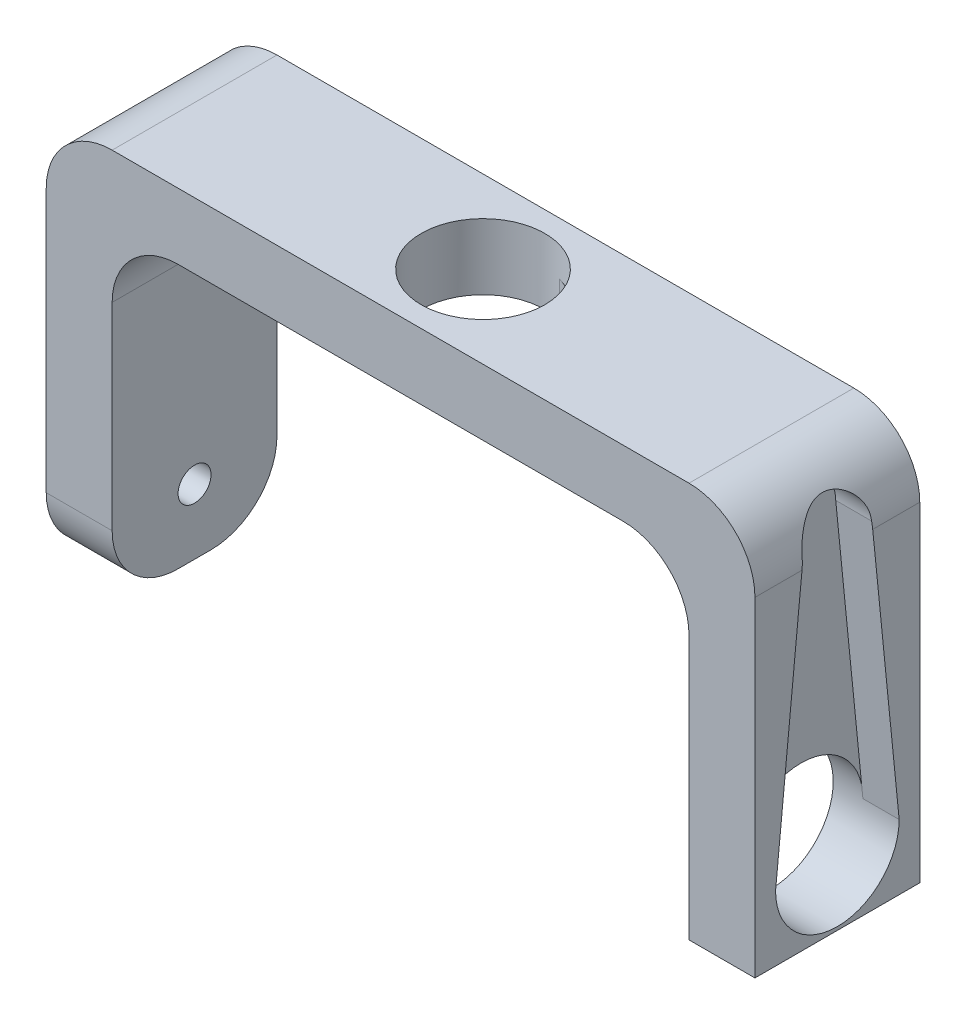
ISO-10303-21;
HEADER;
FILE_DESCRIPTION(('STEP AP214'),'2;1');
FILE_NAME('part.step','',(''),(''),'','','');
FILE_SCHEMA(('AUTOMOTIVE_DESIGN { 1 0 10303 214 1 1 1 1 }'));
ENDSEC;
DATA;
#1=APPLICATION_CONTEXT('core data for automotive mechanical design processes');
#2=APPLICATION_PROTOCOL_DEFINITION('international standard','automotive_design',2000,#1);
#3=PRODUCT_CONTEXT('',#1,'mechanical');
#4=PRODUCT('Part','Part','',(#3));
#5=PRODUCT_RELATED_PRODUCT_CATEGORY('part','',(#4));
#6=PRODUCT_DEFINITION_FORMATION('','',#4);
#7=PRODUCT_DEFINITION_CONTEXT('part definition',#1,'design');
#8=PRODUCT_DEFINITION('design','',#6,#7);
#9=PRODUCT_DEFINITION_SHAPE('','',#8);
#10=(LENGTH_UNIT() NAMED_UNIT(*) SI_UNIT(.MILLI.,.METRE.));
#11=(NAMED_UNIT(*) PLANE_ANGLE_UNIT() SI_UNIT($,.RADIAN.));
#12=(NAMED_UNIT(*) SI_UNIT($,.STERADIAN.) SOLID_ANGLE_UNIT());
#13=UNCERTAINTY_MEASURE_WITH_UNIT(LENGTH_MEASURE(1.E-05),#10,'distance_accuracy_value','');
#14=(GEOMETRIC_REPRESENTATION_CONTEXT(3) GLOBAL_UNCERTAINTY_ASSIGNED_CONTEXT((#13)) GLOBAL_UNIT_ASSIGNED_CONTEXT((#10,
#11,#12)) REPRESENTATION_CONTEXT('',''));
#15=CARTESIAN_POINT('',(0.,0.,0.));
#16=DIRECTION('',(0.,0.,1.));
#17=DIRECTION('',(1.,0.,0.));
#18=AXIS2_PLACEMENT_3D('',#15,#16,#17);
#19=CARTESIAN_POINT('',(13.5,-3.99999999999999,10.));
#20=DIRECTION('',(0.,0.,1.));
#21=DIRECTION('',(1.,0.,0.));
#22=AXIS2_PLACEMENT_3D('',#19,#20,#21);
#23=CYLINDRICAL_SURFACE('',#22,4.);
#24=CARTESIAN_POINT('',(16.,-0.877501000800792,3.5));
#25=CARTESIAN_POINT('',(16.0499443258754,-0.917480572917894,3.50000664736922));
#26=CARTESIAN_POINT('',(16.0988720306926,-0.958628836505276,3.50249284320046));
#27=CARTESIAN_POINT('',(16.194399561014,-1.04293170834118,3.51187627364179));
#28=CARTESIAN_POINT('',(16.2410028763124,-1.08608310874983,3.51876666693516));
#29=CARTESIAN_POINT('',(16.3762972155051,-1.21744625962051,3.54507868083405));
#30=CARTESIAN_POINT('',(16.4613770101921,-1.30829481005846,3.57016138159402));
#31=CARTESIAN_POINT('',(16.6010704584706,-1.47177795685902,3.62419177130241));
#32=CARTESIAN_POINT('',(16.6580019628395,-1.54333063265978,3.65063131878916));
#33=CARTESIAN_POINT('',(16.7659257744413,-1.68873979330161,3.70883278935634));
#34=CARTESIAN_POINT('',(16.8169157966829,-1.76259715073019,3.74059674873665));
#35=CARTESIAN_POINT('',(16.9615914526269,-1.98770816889874,3.84269715337706));
#36=CARTESIAN_POINT('',(17.0463809668835,-2.14178572278003,3.91958779651535));
#37=CARTESIAN_POINT('',(17.1719451393046,-2.40882707410655,4.06049477439984));
#38=CARTESIAN_POINT('',(17.2183494901931,-2.52072060403145,4.12175493815134));
#39=CARTESIAN_POINT('',(17.3003058995101,-2.74618204567143,4.24840610434412));
#40=CARTESIAN_POINT('',(17.3358529282826,-2.85975070793188,4.31379900439806));
#41=CARTESIAN_POINT('',(17.4265814481101,-3.20158127905848,4.51389690071893));
#42=CARTESIAN_POINT('',(17.4661725746963,-3.43167039461583,4.65290508939552));
#43=CARTESIAN_POINT('',(17.4949405919345,-3.771100158997,4.85984111285279));
#44=CARTESIAN_POINT('',(17.4996914634749,-3.8801548314944,4.92661053893652));
#45=CARTESIAN_POINT('',(17.4999951476347,-3.99280852919261,4.99559613810625));
#46=CARTESIAN_POINT('',(17.4999999957969,-3.99640426422287,4.99779806702525));
#47=CARTESIAN_POINT('',(17.5,-3.99999999999999,5.));
#48=B_SPLINE_CURVE_WITH_KNOTS('',3,(#24,#25,#26,#27,#28,#29,#30,#31,#32,#33,#34,#35,#36,#37,#38,
#39,#40,#41,#42,#43,#44,#45,#46,#47),.UNSPECIFIED.,.F.,.F.,(4,2,2,2,2,2,2,2,2,2,2,4),(0.,
0.191756168751828,0.383215192100421,0.762689546213962,1.04789290536096,1.33320558929084,
1.90670189767263,2.31346528001308,2.7204168107548,3.53176072505478,3.91540650413547,
3.92805562313924),.UNSPECIFIED.);
#49=CARTESIAN_POINT('',(17.5,-3.99999999999999,5.));
#50=VERTEX_POINT('',#49);
#51=CARTESIAN_POINT('',(16.,-0.877501000800793,3.5));
#52=VERTEX_POINT('',#51);
#53=EDGE_CURVE('E238',#50,#52,#48,.F.);
#54=ORIENTED_EDGE('',*,*,#53,.T.);
#55=CARTESIAN_POINT('',(13.5,-3.99999999999999,3.1484375));
#56=DIRECTION('',(0.139254831399099,0.,-0.990256578838035));
#57=DIRECTION('',(0.990256578838035,0.,0.139254831399099));
#58=AXIS2_PLACEMENT_3D('',#55,#56,#57);
#59=ELLIPSE('',#58,4.03935715801413,4.);
#60=CARTESIAN_POINT('',(13.5,0.,3.1484375));
#61=VERTEX_POINT('',#60);
#62=EDGE_CURVE('E46',#52,#61,#59,.F.);
#63=ORIENTED_EDGE('',*,*,#62,.T.);
#64=DIRECTION('',(0.,0.,-1.));
#65=VECTOR('',#64,1.);
#66=CARTESIAN_POINT('',(13.5,0.,10.));
#67=LINE('',#66,#65);
#68=CARTESIAN_POINT('',(13.5,0.,0.));
#69=VERTEX_POINT('',#68);
#70=EDGE_CURVE('E427',#69,#61,#67,.F.);
#71=ORIENTED_EDGE('',*,*,#70,.F.);
#72=CARTESIAN_POINT('',(13.5,-3.99999999999999,0.));
#73=DIRECTION('',(0.,0.,-1.));
#74=DIRECTION('',(-1.,0.,0.));
#75=AXIS2_PLACEMENT_3D('',#72,#73,#74);
#76=CIRCLE('',#75,4.);
#77=CARTESIAN_POINT('',(17.5,-3.99999999999999,0.));
#78=VERTEX_POINT('',#77);
#79=EDGE_CURVE('E431',#78,#69,#76,.F.);
#80=ORIENTED_EDGE('',*,*,#79,.F.);
#81=DIRECTION('',(0.,0.,-1.));
#82=VECTOR('',#81,1.);
#83=CARTESIAN_POINT('',(17.5,-3.99999999999999,0.));
#84=LINE('',#83,#82);
#85=EDGE_CURVE('E299',#50,#78,#84,.T.);
#86=ORIENTED_EDGE('',*,*,#85,.F.);
#87=EDGE_LOOP('',(#54,#63,#71,#80,#86));
#88=FACE_BOUND('',#87,.T.);
#89=ADVANCED_FACE('F37',(#88),#23,.F.);
#90=CARTESIAN_POINT('',(21.5,0.,10.));
#91=DIRECTION('',(-1.,0.,0.));
#92=DIRECTION('',(0.,-1.,0.));
#93=AXIS2_PLACEMENT_3D('',#90,#91,#92);
#94=PLANE('',#93);
#95=DIRECTION('',(0.,0.995037190209989,0.0995037190209989));
#96=VECTOR('',#95,1.);
#97=CARTESIAN_POINT('',(21.5,-0.282673267326725,2.82673267326733));
#98=LINE('',#97,#96);
#99=CARTESIAN_POINT('',(21.5,-16.05,1.25));
#100=VERTEX_POINT('',#99);
#101=CARTESIAN_POINT('',(21.5,0.,2.855));
#102=VERTEX_POINT('',#101);
#103=EDGE_CURVE('E323',#100,#102,#98,.T.);
#104=ORIENTED_EDGE('',*,*,#103,.F.);
#105=CARTESIAN_POINT('',(21.5,-16.05,5.));
#106=DIRECTION('',(-1.,0.,0.));
#107=DIRECTION('',(0.,-1.,0.));
#108=AXIS2_PLACEMENT_3D('',#105,#106,#107);
#109=CIRCLE('',#108,3.75);
#110=CARTESIAN_POINT('',(21.5,-16.05,8.75));
#111=VERTEX_POINT('',#110);
#112=EDGE_CURVE('E325',#100,#111,#109,.T.);
#113=ORIENTED_EDGE('',*,*,#112,.T.);
#114=DIRECTION('',(0.,-0.995037190209989,0.099503719020999));
#115=VECTOR('',#114,1.);
#116=CARTESIAN_POINT('',(21.5,0.707425742574265,7.07425742574258));
#117=LINE('',#116,#115);
#118=CARTESIAN_POINT('',(21.5,0.,7.145));
#119=VERTEX_POINT('',#118);
#120=EDGE_CURVE('E329',#119,#111,#117,.T.);
#121=ORIENTED_EDGE('',*,*,#120,.F.);
#122=DIRECTION('',(0.,0.,-1.));
#123=VECTOR('',#122,1.);
#124=CARTESIAN_POINT('',(21.5,0.,10.));
#125=LINE('',#124,#123);
#126=CARTESIAN_POINT('',(21.5,0.,10.));
#127=VERTEX_POINT('',#126);
#128=EDGE_CURVE('E411',#119,#127,#125,.F.);
#129=ORIENTED_EDGE('',*,*,#128,.T.);
#130=DIRECTION('',(0.,1.,0.));
#131=VECTOR('',#130,1.);
#132=CARTESIAN_POINT('',(21.5,0.,10.));
#133=LINE('',#132,#131);
#134=CARTESIAN_POINT('',(21.5,-20.,10.));
#135=VERTEX_POINT('',#134);
#136=EDGE_CURVE('E367',#135,#127,#133,.T.);
#137=ORIENTED_EDGE('',*,*,#136,.F.);
#138=DIRECTION('',(0.,0.,-1.));
#139=VECTOR('',#138,1.);
#140=CARTESIAN_POINT('',(21.5,-20.,10.));
#141=LINE('',#140,#139);
#142=CARTESIAN_POINT('',(21.5,-20.,0.));
#143=VERTEX_POINT('',#142);
#144=EDGE_CURVE('E373',#135,#143,#141,.T.);
#145=ORIENTED_EDGE('',*,*,#144,.T.);
#146=DIRECTION('',(0.,1.,0.));
#147=VECTOR('',#146,1.);
#148=CARTESIAN_POINT('',(21.5,0.,0.));
#149=LINE('',#148,#147);
#150=CARTESIAN_POINT('',(21.5,0.,0.));
#151=VERTEX_POINT('',#150);
#152=EDGE_CURVE('E388',#143,#151,#149,.T.);
#153=ORIENTED_EDGE('',*,*,#152,.T.);
#154=EDGE_CURVE('E412',#151,#102,#125,.F.);
#155=ORIENTED_EDGE('',*,*,#154,.T.);
#156=EDGE_LOOP('',(#104,#113,#121,#129,#137,#145,#153,#155));
#157=FACE_BOUND('',#156,.T.);
#158=ADVANCED_FACE('F286',(#157),#94,.F.);
#159=CARTESIAN_POINT('',(17.5,0.,10.));
#160=DIRECTION('',(0.,0.,-1.));
#161=DIRECTION('',(-1.,0.,0.));
#162=AXIS2_PLACEMENT_3D('',#159,#160,#161);
#163=CYLINDRICAL_SURFACE('',#162,4.);
#164=CARTESIAN_POINT('',(21.4746068988014,0.450000000000017,2.9));
#165=CARTESIAN_POINT('',(21.4681675351765,0.506973592942359,2.89999087678292));
#166=CARTESIAN_POINT('',(21.4604830273316,0.563793256044316,2.90231813602664));
#167=CARTESIAN_POINT('',(21.4427619169186,0.676658026146143,2.91150306465754));
#168=CARTESIAN_POINT('',(21.4327268687985,0.732703619222742,2.91835774542053));
#169=CARTESIAN_POINT('',(21.4104964865748,0.843319045639043,2.93640481496226));
#170=CARTESIAN_POINT('',(21.3983135725214,0.89789538853453,2.94757268256058));
#171=CARTESIAN_POINT('',(21.3719485484852,1.00552956987553,2.97405284298865));
#172=CARTESIAN_POINT('',(21.3577661683049,1.05858720192263,2.98936569620797));
#173=CARTESIAN_POINT('',(21.3126210816327,1.21474384832189,3.04113480206087));
#174=CARTESIAN_POINT('',(21.2789862292442,1.31518642312177,3.0834821818744));
#175=CARTESIAN_POINT('',(21.2066873874522,1.50699192435991,3.18218648570632));
#176=CARTESIAN_POINT('',(21.168016684352,1.59834243736541,3.23856220508652));
#177=CARTESIAN_POINT('',(21.0842453497548,1.77875262584939,3.36966859631342));
#178=CARTESIAN_POINT('',(21.0388814269496,1.86680344889192,3.44562100882886));
#179=CARTESIAN_POINT('',(20.9482366624768,2.02937170828097,3.61109265196378));
#180=CARTESIAN_POINT('',(20.9029560236809,2.10387018014269,3.7006305771895));
#181=CARTESIAN_POINT('',(20.8124963994499,2.2438587348356,3.90077034041544));
#182=CARTESIAN_POINT('',(20.767691858097,2.30793864148862,4.01254178363922));
#183=CARTESIAN_POINT('',(20.6890863185897,2.41540924834848,4.24906482180221));
#184=CARTESIAN_POINT('',(20.6552518462896,2.45886307906207,4.37377536703262));
#185=CARTESIAN_POINT('',(20.6129149222645,2.51207674201889,4.59223127142897));
#186=CARTESIAN_POINT('',(20.5998087890453,2.52810928883553,4.68356709562185));
#187=CARTESIAN_POINT('',(20.583545156348,2.54792597100415,4.86840438116769));
#188=CARTESIAN_POINT('',(20.5803776115965,2.55172247385249,4.96190355956293));
#189=CARTESIAN_POINT('',(20.5844229477366,2.54682967952268,5.14836802143399));
#190=CARTESIAN_POINT('',(20.591639936625,2.53813544115933,5.24133307900961));
#191=CARTESIAN_POINT('',(20.6154807994742,2.50880939181318,5.42413561031941));
#192=CARTESIAN_POINT('',(20.6321126283867,2.48816748546519,5.51397037091949));
#193=CARTESIAN_POINT('',(20.6732760524602,2.43545654313032,5.69037743076212));
#194=CARTESIAN_POINT('',(20.6979642410422,2.40315952475895,5.77684351505162));
#195=CARTESIAN_POINT('',(20.7527961302297,2.32840370934786,5.94336670218473));
#196=CARTESIAN_POINT('',(20.7829417146468,2.28594140176514,6.02342157816845));
#197=CARTESIAN_POINT('',(20.853068952875,2.18211139575872,6.19228208686113));
#198=CARTESIAN_POINT('',(20.8937974150689,2.11865102805151,6.27949163057972));
#199=CARTESIAN_POINT('',(20.9767686895053,1.97955851140038,6.44290726896988));
#200=CARTESIAN_POINT('',(21.0190133476965,1.90391110524927,6.51909934074123));
#201=CARTESIAN_POINT('',(21.1090807180592,1.72796209189734,6.67107098245369));
#202=CARTESIAN_POINT('',(21.1566664392876,1.62565236609649,6.74468601676938));
#203=CARTESIAN_POINT('',(21.2459659740646,1.40766819364366,6.87317849727017));
#204=CARTESIAN_POINT('',(21.2876909347815,1.29201990177049,6.9280918056657));
#205=CARTESIAN_POINT('',(21.3419786779214,1.1147672157086,6.99291286685265));
#206=CARTESIAN_POINT('',(21.3582248263646,1.05724107754214,7.01120259220349));
#207=CARTESIAN_POINT('',(21.3883890763154,0.940250611238677,7.04287091423451));
#208=CARTESIAN_POINT('',(21.4023077276067,0.880786744793846,7.0562506716048));
#209=CARTESIAN_POINT('',(21.427628596704,0.759974429472243,7.07790861538969));
#210=CARTESIAN_POINT('',(21.4390131326097,0.698615944296202,7.0861516358715));
#211=CARTESIAN_POINT('',(21.4589708974405,0.574902146761671,7.09720637746815));
#212=CARTESIAN_POINT('',(21.4675414458305,0.512545942942872,7.10001293233423));
#213=CARTESIAN_POINT('',(21.4746068988014,0.450000000000018,7.1));
#214=B_SPLINE_CURVE_WITH_KNOTS('',3,(#164,#165,#166,#167,#168,#169,#170,#171,#172,#173,#174,
#175,#176,#177,#178,#179,#180,#181,#182,#183,#184,#185,#186,#187,#188,#189,#190,#191,#192,#193,
#194,#195,#196,#197,#198,#199,#200,#201,#202,#203,#204,#205,#206,#207,#208,#209,#210,#211,#212,
#213),.UNSPECIFIED.,.F.,.F.,(4,2,2,2,2,2,2,2,2,2,2,2,2,2,2,2,2,2,2,2,2,2,2,2,4),(0.,
0.171928187875553,0.343742996449487,0.514595056234783,0.685470226250354,1.02611736950578,
1.36722339734321,1.74015322622361,2.11360096619102,2.52059205552011,2.92632929867399,
3.20607770479334,3.48554326833774,3.76511941550301,4.04493214039743,4.33054454913269,
4.61625573565058,4.96084153522744,5.30586213004962,5.70810930821384,6.10958074061249,
6.29689843683584,6.48417182359157,6.67271358520368,6.86143442947186),.UNSPECIFIED.);
#215=CARTESIAN_POINT('',(21.4746068988014,0.450000000000017,2.9));
#216=VERTEX_POINT('',#215);
#217=CARTESIAN_POINT('',(21.4746068988014,0.450000000000017,7.1));
#218=VERTEX_POINT('',#217);
#219=EDGE_CURVE('E442',#216,#218,#214,.T.);
#220=ORIENTED_EDGE('',*,*,#219,.F.);
#221=CARTESIAN_POINT('',(17.5,0.,2.855));
#222=DIRECTION('',(0.,-0.0995037190209989,0.995037190209989));
#223=DIRECTION('',(0.,-0.995037190209989,-0.0995037190209989));
#224=AXIS2_PLACEMENT_3D('',#221,#222,#223);
#225=ELLIPSE('',#224,4.01995024844836,4.);
#226=EDGE_CURVE('E450',#216,#102,#225,.F.);
#227=ORIENTED_EDGE('',*,*,#226,.T.);
#228=ORIENTED_EDGE('',*,*,#154,.F.);
#229=CARTESIAN_POINT('',(17.5,0.,0.));
#230=DIRECTION('',(0.,0.,-1.));
#231=DIRECTION('',(-1.,0.,0.));
#232=AXIS2_PLACEMENT_3D('',#229,#230,#231);
#233=CIRCLE('',#232,4.);
#234=CARTESIAN_POINT('',(17.5,4.00000000000001,0.));
#235=VERTEX_POINT('',#234);
#236=EDGE_CURVE('E409',#235,#151,#233,.T.);
#237=ORIENTED_EDGE('',*,*,#236,.F.);
#238=DIRECTION('',(0.,0.,-1.));
#239=VECTOR('',#238,1.);
#240=CARTESIAN_POINT('',(17.5,4.00000000000001,10.));
#241=LINE('',#240,#239);
#242=CARTESIAN_POINT('',(17.5,4.00000000000001,10.));
#243=VERTEX_POINT('',#242);
#244=EDGE_CURVE('E404',#243,#235,#241,.T.);
#245=ORIENTED_EDGE('',*,*,#244,.F.);
#246=CARTESIAN_POINT('',(17.5,0.,10.));
#247=DIRECTION('',(0.,0.,-1.));
#248=DIRECTION('',(-1.,0.,0.));
#249=AXIS2_PLACEMENT_3D('',#246,#247,#248);
#250=CIRCLE('',#249,4.);
#251=EDGE_CURVE('E417',#127,#243,#250,.F.);
#252=ORIENTED_EDGE('',*,*,#251,.F.);
#253=ORIENTED_EDGE('',*,*,#128,.F.);
#254=CARTESIAN_POINT('',(17.5,0.,7.145));
#255=DIRECTION('',(0.,-0.0995037190209989,-0.995037190209989));
#256=DIRECTION('',(0.,0.995037190209989,-0.099503719020999));
#257=AXIS2_PLACEMENT_3D('',#254,#255,#256);
#258=ELLIPSE('',#257,4.01995024844836,4.);
#259=EDGE_CURVE('E439',#119,#218,#258,.F.);
#260=ORIENTED_EDGE('',*,*,#259,.T.);
#261=EDGE_LOOP('',(#220,#227,#228,#237,#245,#252,#253,#260));
#262=FACE_BOUND('',#261,.T.);
#263=ADVANCED_FACE('F291',(#262),#163,.T.);
#264=CARTESIAN_POINT('',(-21.5,0.,10.));
#265=DIRECTION('',(1.,0.,0.));
#266=DIRECTION('',(0.,1.,0.));
#267=AXIS2_PLACEMENT_3D('',#264,#265,#266);
#268=PLANE('',#267);
#269=CARTESIAN_POINT('',(-21.5,-16.05,5.));
#270=DIRECTION('',(-1.,0.,0.));
#271=DIRECTION('',(0.,-1.,0.));
#272=AXIS2_PLACEMENT_3D('',#269,#270,#271);
#273=CIRCLE('',#272,1.);
#274=CARTESIAN_POINT('',(-21.5,-17.05,5.));
#275=VERTEX_POINT('',#274);
#276=EDGE_CURVE('E311',#275,#275,#273,.T.);
#277=ORIENTED_EDGE('',*,*,#276,.F.);
#278=EDGE_LOOP('',(#277));
#279=FACE_BOUND('',#278,.T.);
#280=DIRECTION('',(0.,-1.,0.));
#281=VECTOR('',#280,1.);
#282=CARTESIAN_POINT('',(-21.5,0.,0.));
#283=LINE('',#282,#281);
#284=CARTESIAN_POINT('',(-21.5,0.,0.));
#285=VERTEX_POINT('',#284);
#286=CARTESIAN_POINT('',(-21.5,-16.,0.));
#287=VERTEX_POINT('',#286);
#288=EDGE_CURVE('E345',#285,#287,#283,.T.);
#289=ORIENTED_EDGE('',*,*,#288,.T.);
#290=CARTESIAN_POINT('',(-21.5,-16.,4.));
#291=DIRECTION('',(1.,0.,0.));
#292=DIRECTION('',(0.,1.,0.));
#293=AXIS2_PLACEMENT_3D('',#290,#291,#292);
#294=CIRCLE('',#293,4.);
#295=CARTESIAN_POINT('',(-21.5,-20.,4.));
#296=VERTEX_POINT('',#295);
#297=EDGE_CURVE('E514',#287,#296,#294,.F.);
#298=ORIENTED_EDGE('',*,*,#297,.T.);
#299=DIRECTION('',(0.,0.,-1.));
#300=VECTOR('',#299,1.);
#301=CARTESIAN_POINT('',(-21.5,-20.,10.));
#302=LINE('',#301,#300);
#303=CARTESIAN_POINT('',(-21.5,-20.,6.));
#304=VERTEX_POINT('',#303);
#305=EDGE_CURVE('E399',#304,#296,#302,.T.);
#306=ORIENTED_EDGE('',*,*,#305,.F.);
#307=CARTESIAN_POINT('',(-21.5,-16.,6.));
#308=DIRECTION('',(1.,0.,0.));
#309=DIRECTION('',(0.,1.,0.));
#310=AXIS2_PLACEMENT_3D('',#307,#308,#309);
#311=CIRCLE('',#310,4.);
#312=CARTESIAN_POINT('',(-21.5,-16.,10.));
#313=VERTEX_POINT('',#312);
#314=EDGE_CURVE('E522',#304,#313,#311,.F.);
#315=ORIENTED_EDGE('',*,*,#314,.T.);
#316=DIRECTION('',(0.,-1.,0.));
#317=VECTOR('',#316,1.);
#318=CARTESIAN_POINT('',(-21.5,0.,10.));
#319=LINE('',#318,#317);
#320=CARTESIAN_POINT('',(-21.5,0.,10.));
#321=VERTEX_POINT('',#320);
#322=EDGE_CURVE('E353',#321,#313,#319,.T.);
#323=ORIENTED_EDGE('',*,*,#322,.F.);
#324=DIRECTION('',(0.,0.,-1.));
#325=VECTOR('',#324,1.);
#326=CARTESIAN_POINT('',(-21.5,0.,10.));
#327=LINE('',#326,#325);
#328=EDGE_CURVE('E419',#321,#285,#327,.T.);
#329=ORIENTED_EDGE('',*,*,#328,.T.);
#330=EDGE_LOOP('',(#289,#298,#306,#315,#323,#329));
#331=FACE_BOUND('',#330,.T.);
#332=ADVANCED_FACE('F502',(#279,#331),#268,.F.);
#333=CARTESIAN_POINT('',(-17.5,-20.,10.));
#334=DIRECTION('',(0.,-1.,0.));
#335=DIRECTION('',(0.,0.,-1.));
#336=AXIS2_PLACEMENT_3D('',#333,#334,#335);
#337=PLANE('',#336);
#338=ORIENTED_EDGE('',*,*,#305,.T.);
#339=DIRECTION('',(-1.,0.,0.));
#340=VECTOR('',#339,1.);
#341=CARTESIAN_POINT('',(-17.5,-20.,4.));
#342=LINE('',#341,#340);
#343=CARTESIAN_POINT('',(-17.5,-20.,4.));
#344=VERTEX_POINT('',#343);
#345=EDGE_CURVE('E532',#296,#344,#342,.F.);
#346=ORIENTED_EDGE('',*,*,#345,.T.);
#347=DIRECTION('',(0.,0.,-1.));
#348=VECTOR('',#347,1.);
#349=CARTESIAN_POINT('',(-17.5,-20.,10.));
#350=LINE('',#349,#348);
#351=CARTESIAN_POINT('',(-17.5,-20.,6.));
#352=VERTEX_POINT('',#351);
#353=EDGE_CURVE('E396',#352,#344,#350,.T.);
#354=ORIENTED_EDGE('',*,*,#353,.F.);
#355=DIRECTION('',(-1.,0.,0.));
#356=VECTOR('',#355,1.);
#357=CARTESIAN_POINT('',(-21.5,-20.,6.));
#358=LINE('',#357,#356);
#359=EDGE_CURVE('E529',#352,#304,#358,.T.);
#360=ORIENTED_EDGE('',*,*,#359,.T.);
#361=EDGE_LOOP('',(#338,#346,#354,#360));
#362=FACE_BOUND('',#361,.T.);
#363=ADVANCED_FACE('F499',(#362),#337,.T.);
#364=CARTESIAN_POINT('',(-17.5,0.,10.));
#365=DIRECTION('',(1.,0.,0.));
#366=DIRECTION('',(0.,1.,0.));
#367=AXIS2_PLACEMENT_3D('',#364,#365,#366);
#368=PLANE('',#367);
#369=CARTESIAN_POINT('',(-17.5,-16.05,5.));
#370=DIRECTION('',(1.,0.,0.));
#371=DIRECTION('',(0.,1.,0.));
#372=AXIS2_PLACEMENT_3D('',#369,#370,#371);
#373=CIRCLE('',#372,1.);
#374=CARTESIAN_POINT('',(-17.5,-15.05,5.));
#375=VERTEX_POINT('',#374);
#376=EDGE_CURVE('E316',#375,#375,#373,.T.);
#377=ORIENTED_EDGE('',*,*,#376,.F.);
#378=EDGE_LOOP('',(#377));
#379=FACE_BOUND('',#378,.T.);
#380=ORIENTED_EDGE('',*,*,#353,.T.);
#381=CARTESIAN_POINT('',(-17.5,-16.,4.));
#382=DIRECTION('',(1.,0.,0.));
#383=DIRECTION('',(0.,1.,0.));
#384=AXIS2_PLACEMENT_3D('',#381,#382,#383);
#385=CIRCLE('',#384,4.);
#386=CARTESIAN_POINT('',(-17.5,-16.,0.));
#387=VERTEX_POINT('',#386);
#388=EDGE_CURVE('E536',#344,#387,#385,.T.);
#389=ORIENTED_EDGE('',*,*,#388,.T.);
#390=DIRECTION('',(0.,-1.,0.));
#391=VECTOR('',#390,1.);
#392=CARTESIAN_POINT('',(-17.5,0.,0.));
#393=LINE('',#392,#391);
#394=CARTESIAN_POINT('',(-17.5,-4.,0.));
#395=VERTEX_POINT('',#394);
#396=EDGE_CURVE('E376',#395,#387,#393,.T.);
#397=ORIENTED_EDGE('',*,*,#396,.F.);
#398=DIRECTION('',(0.,0.,-1.));
#399=VECTOR('',#398,1.);
#400=CARTESIAN_POINT('',(-17.5,-4.,10.));
#401=LINE('',#400,#399);
#402=CARTESIAN_POINT('',(-17.5,-4.,10.));
#403=VERTEX_POINT('',#402);
#404=EDGE_CURVE('E429',#395,#403,#401,.F.);
#405=ORIENTED_EDGE('',*,*,#404,.T.);
#406=DIRECTION('',(0.,-1.,0.));
#407=VECTOR('',#406,1.);
#408=CARTESIAN_POINT('',(-17.5,0.,10.));
#409=LINE('',#408,#407);
#410=CARTESIAN_POINT('',(-17.5,-16.,10.));
#411=VERTEX_POINT('',#410);
#412=EDGE_CURVE('E355',#403,#411,#409,.T.);
#413=ORIENTED_EDGE('',*,*,#412,.T.);
#414=CARTESIAN_POINT('',(-17.5,-16.,6.));
#415=DIRECTION('',(1.,0.,0.));
#416=DIRECTION('',(0.,1.,0.));
#417=AXIS2_PLACEMENT_3D('',#414,#415,#416);
#418=CIRCLE('',#417,4.);
#419=EDGE_CURVE('E534',#411,#352,#418,.T.);
#420=ORIENTED_EDGE('',*,*,#419,.T.);
#421=EDGE_LOOP('',(#380,#389,#397,#405,#413,#420));
#422=FACE_BOUND('',#421,.T.);
#423=ADVANCED_FACE('F495',(#379,#422),#368,.T.);
#424=CARTESIAN_POINT('',(-17.5,0.,10.));
#425=DIRECTION('',(0.,-1.,0.));
#426=DIRECTION('',(1.,0.,0.));
#427=AXIS2_PLACEMENT_3D('',#424,#425,#426);
#428=PLANE('',#427);
#429=DIRECTION('',(0.990256578838035,0.,0.139254831399099));
#430=VECTOR('',#429,1.);
#431=CARTESIAN_POINT('',(-15.9540339956907,0.,-0.993536030644003));
#432=LINE('',#431,#430);
#433=CARTESIAN_POINT('',(1.03423509695954,0.,1.39543931050994));
#434=VERTEX_POINT('',#433);
#435=EDGE_CURVE('E310',#434,#61,#432,.T.);
#436=ORIENTED_EDGE('',*,*,#435,.F.);
#437=CARTESIAN_POINT('',(0.,0.,5.));
#438=DIRECTION('',(0.,-1.,0.));
#439=DIRECTION('',(1.,0.,0.));
#440=AXIS2_PLACEMENT_3D('',#437,#438,#439);
#441=CIRCLE('',#440,3.75);
#442=CARTESIAN_POINT('',(1.03423509695954,0.,8.60456068949006));
#443=VERTEX_POINT('',#442);
#444=EDGE_CURVE('E11',#443,#434,#441,.T.);
#445=ORIENTED_EDGE('',*,*,#444,.F.);
#446=DIRECTION('',(-0.990256578838035,0.,0.139254831399099));
#447=VECTOR('',#446,1.);
#448=CARTESIAN_POINT('',(-17.3330141249701,0.,11.1874551113239));
#449=LINE('',#448,#447);
#450=CARTESIAN_POINT('',(13.5,0.,6.8515625));
#451=VERTEX_POINT('',#450);
#452=EDGE_CURVE('E226',#451,#443,#449,.T.);
#453=ORIENTED_EDGE('',*,*,#452,.F.);
#454=CARTESIAN_POINT('',(13.5,0.,10.));
#455=VERTEX_POINT('',#454);
#456=EDGE_CURVE('E426',#451,#455,#67,.F.);
#457=ORIENTED_EDGE('',*,*,#456,.T.);
#458=DIRECTION('',(-1.,0.,0.));
#459=VECTOR('',#458,1.);
#460=CARTESIAN_POINT('',(-17.5,0.,10.));
#461=LINE('',#460,#459);
#462=CARTESIAN_POINT('',(-13.5,0.,10.));
#463=VERTEX_POINT('',#462);
#464=EDGE_CURVE('E358',#455,#463,#461,.T.);
#465=ORIENTED_EDGE('',*,*,#464,.T.);
#466=DIRECTION('',(0.,0.,-1.));
#467=VECTOR('',#466,1.);
#468=CARTESIAN_POINT('',(-13.5,0.,0.));
#469=LINE('',#468,#467);
#470=CARTESIAN_POINT('',(-13.5,0.,0.));
#471=VERTEX_POINT('',#470);
#472=EDGE_CURVE('E423',#463,#471,#469,.T.);
#473=ORIENTED_EDGE('',*,*,#472,.T.);
#474=DIRECTION('',(-1.,0.,0.));
#475=VECTOR('',#474,1.);
#476=CARTESIAN_POINT('',(-17.5,0.,0.));
#477=LINE('',#476,#475);
#478=EDGE_CURVE('E379',#69,#471,#477,.T.);
#479=ORIENTED_EDGE('',*,*,#478,.F.);
#480=ORIENTED_EDGE('',*,*,#70,.T.);
#481=EDGE_LOOP('',(#436,#445,#453,#457,#465,#473,#479,#480));
#482=FACE_BOUND('',#481,.T.);
#483=ADVANCED_FACE('F491',(#482),#428,.T.);
#484=CARTESIAN_POINT('',(17.5,0.,10.));
#485=DIRECTION('',(-1.,0.,0.));
#486=DIRECTION('',(0.,-1.,0.));
#487=AXIS2_PLACEMENT_3D('',#484,#485,#486);
#488=PLANE('',#487);
#489=CARTESIAN_POINT('',(17.5,-16.05,5.));
#490=DIRECTION('',(-1.,0.,0.));
#491=DIRECTION('',(0.,-1.,0.));
#492=AXIS2_PLACEMENT_3D('',#489,#490,#491);
#493=CIRCLE('',#492,3.75);
#494=CARTESIAN_POINT('',(17.5,-19.8,5.));
#495=VERTEX_POINT('',#494);
#496=EDGE_CURVE('E320',#495,#495,#493,.T.);
#497=ORIENTED_EDGE('',*,*,#496,.F.);
#498=EDGE_LOOP('',(#497));
#499=FACE_BOUND('',#498,.T.);
#500=DIRECTION('',(0.,1.,0.));
#501=VECTOR('',#500,1.);
#502=CARTESIAN_POINT('',(17.5,0.,0.));
#503=LINE('',#502,#501);
#504=CARTESIAN_POINT('',(17.5,-20.,0.));
#505=VERTEX_POINT('',#504);
#506=EDGE_CURVE('E382',#505,#78,#503,.T.);
#507=ORIENTED_EDGE('',*,*,#506,.F.);
#508=DIRECTION('',(0.,0.,-1.));
#509=VECTOR('',#508,1.);
#510=CARTESIAN_POINT('',(17.5,-20.,10.));
#511=LINE('',#510,#509);
#512=CARTESIAN_POINT('',(17.5,-20.,10.));
#513=VERTEX_POINT('',#512);
#514=EDGE_CURVE('E394',#513,#505,#511,.T.);
#515=ORIENTED_EDGE('',*,*,#514,.F.);
#516=DIRECTION('',(0.,1.,0.));
#517=VECTOR('',#516,1.);
#518=CARTESIAN_POINT('',(17.5,0.,10.));
#519=LINE('',#518,#517);
#520=CARTESIAN_POINT('',(17.5,-3.99999999999999,10.));
#521=VERTEX_POINT('',#520);
#522=EDGE_CURVE('E361',#513,#521,#519,.T.);
#523=ORIENTED_EDGE('',*,*,#522,.T.);
#524=EDGE_CURVE('E307',#521,#50,#84,.T.);
#525=ORIENTED_EDGE('',*,*,#524,.T.);
#526=ORIENTED_EDGE('',*,*,#85,.T.);
#527=EDGE_LOOP('',(#507,#515,#523,#525,#526));
#528=FACE_BOUND('',#527,.T.);
#529=ADVANCED_FACE('F487',(#499,#528),#488,.T.);
#530=CARTESIAN_POINT('',(21.5,-20.,10.));
#531=DIRECTION('',(0.,-1.,0.));
#532=DIRECTION('',(0.,0.,-1.));
#533=AXIS2_PLACEMENT_3D('',#530,#531,#532);
#534=PLANE('',#533);
#535=DIRECTION('',(-1.,0.,0.));
#536=VECTOR('',#535,1.);
#537=CARTESIAN_POINT('',(21.5,-20.,0.));
#538=LINE('',#537,#536);
#539=EDGE_CURVE('E385',#143,#505,#538,.T.);
#540=ORIENTED_EDGE('',*,*,#539,.F.);
#541=ORIENTED_EDGE('',*,*,#144,.F.);
#542=DIRECTION('',(-1.,0.,0.));
#543=VECTOR('',#542,1.);
#544=CARTESIAN_POINT('',(21.5,-20.,10.));
#545=LINE('',#544,#543);
#546=EDGE_CURVE('E364',#135,#513,#545,.T.);
#547=ORIENTED_EDGE('',*,*,#546,.T.);
#548=ORIENTED_EDGE('',*,*,#514,.T.);
#549=EDGE_LOOP('',(#540,#541,#547,#548));
#550=FACE_BOUND('',#549,.T.);
#551=ADVANCED_FACE('F482',(#550),#534,.T.);
#552=CARTESIAN_POINT('',(-17.5,4.,10.));
#553=DIRECTION('',(0.,-1.,0.));
#554=DIRECTION('',(1.,0.,0.));
#555=AXIS2_PLACEMENT_3D('',#552,#553,#554);
#556=PLANE('',#555);
#557=CARTESIAN_POINT('',(0.,4.,5.));
#558=DIRECTION('',(0.,-1.,0.));
#559=DIRECTION('',(1.,0.,0.));
#560=AXIS2_PLACEMENT_3D('',#557,#558,#559);
#561=CIRCLE('',#560,3.75);
#562=CARTESIAN_POINT('',(3.75,4.,5.));
#563=VERTEX_POINT('',#562);
#564=EDGE_CURVE('E41',#563,#563,#561,.T.);
#565=ORIENTED_EDGE('',*,*,#564,.T.);
#566=EDGE_LOOP('',(#565));
#567=FACE_BOUND('',#566,.T.);
#568=DIRECTION('',(-1.,0.,0.));
#569=VECTOR('',#568,1.);
#570=CARTESIAN_POINT('',(-17.5,4.,10.));
#571=LINE('',#570,#569);
#572=CARTESIAN_POINT('',(-17.5,4.,10.));
#573=VERTEX_POINT('',#572);
#574=EDGE_CURVE('E370',#243,#573,#571,.T.);
#575=ORIENTED_EDGE('',*,*,#574,.F.);
#576=ORIENTED_EDGE('',*,*,#244,.T.);
#577=DIRECTION('',(-1.,0.,0.));
#578=VECTOR('',#577,1.);
#579=CARTESIAN_POINT('',(-17.5,4.,0.));
#580=LINE('',#579,#578);
#581=CARTESIAN_POINT('',(-17.5,4.,0.));
#582=VERTEX_POINT('',#581);
#583=EDGE_CURVE('E356',#235,#582,#580,.T.);
#584=ORIENTED_EDGE('',*,*,#583,.T.);
#585=DIRECTION('',(0.,0.,-1.));
#586=VECTOR('',#585,1.);
#587=CARTESIAN_POINT('',(-17.5,4.,10.));
#588=LINE('',#587,#586);
#589=EDGE_CURVE('E402',#582,#573,#588,.F.);
#590=ORIENTED_EDGE('',*,*,#589,.T.);
#591=EDGE_LOOP('',(#575,#576,#584,#590));
#592=FACE_BOUND('',#591,.T.);
#593=ADVANCED_FACE('F477',(#567,#592),#556,.F.);
#594=CARTESIAN_POINT('',(0.,0.,10.));
#595=DIRECTION('',(0.,0.,-1.));
#596=DIRECTION('',(-1.,0.,0.));
#597=AXIS2_PLACEMENT_3D('',#594,#595,#596);
#598=PLANE('',#597);
#599=ORIENTED_EDGE('',*,*,#322,.T.);
#600=DIRECTION('',(-1.,0.,0.));
#601=VECTOR('',#600,1.);
#602=CARTESIAN_POINT('',(-17.5,-16.,10.));
#603=LINE('',#602,#601);
#604=EDGE_CURVE('E61',#313,#411,#603,.F.);
#605=ORIENTED_EDGE('',*,*,#604,.T.);
#606=ORIENTED_EDGE('',*,*,#412,.F.);
#607=CARTESIAN_POINT('',(-13.5,-4.,10.));
#608=DIRECTION('',(0.,0.,-1.));
#609=DIRECTION('',(-1.,0.,0.));
#610=AXIS2_PLACEMENT_3D('',#607,#608,#609);
#611=CIRCLE('',#610,4.);
#612=EDGE_CURVE('E437',#403,#463,#611,.T.);
#613=ORIENTED_EDGE('',*,*,#612,.T.);
#614=ORIENTED_EDGE('',*,*,#464,.F.);
#615=CARTESIAN_POINT('',(13.5,-3.99999999999999,10.));
#616=DIRECTION('',(0.,0.,-1.));
#617=DIRECTION('',(-1.,0.,0.));
#618=AXIS2_PLACEMENT_3D('',#615,#616,#617);
#619=CIRCLE('',#618,4.);
#620=EDGE_CURVE('E433',#455,#521,#619,.T.);
#621=ORIENTED_EDGE('',*,*,#620,.T.);
#622=ORIENTED_EDGE('',*,*,#522,.F.);
#623=ORIENTED_EDGE('',*,*,#546,.F.);
#624=ORIENTED_EDGE('',*,*,#136,.T.);
#625=ORIENTED_EDGE('',*,*,#251,.T.);
#626=ORIENTED_EDGE('',*,*,#574,.T.);
#627=CARTESIAN_POINT('',(-17.5,0.,10.));
#628=DIRECTION('',(0.,0.,-1.));
#629=DIRECTION('',(-1.,0.,0.));
#630=AXIS2_PLACEMENT_3D('',#627,#628,#629);
#631=CIRCLE('',#630,4.);
#632=EDGE_CURVE('E415',#573,#321,#631,.F.);
#633=ORIENTED_EDGE('',*,*,#632,.T.);
#634=EDGE_LOOP('',(#599,#605,#606,#613,#614,#621,#622,#623,#624,#625,#626,#633));
#635=FACE_BOUND('',#634,.T.);
#636=ADVANCED_FACE('F473',(#635),#598,.F.);
#637=CARTESIAN_POINT('',(0.,0.,0.));
#638=DIRECTION('',(0.,0.,-1.));
#639=DIRECTION('',(-1.,0.,0.));
#640=AXIS2_PLACEMENT_3D('',#637,#638,#639);
#641=PLANE('',#640);
#642=ORIENTED_EDGE('',*,*,#396,.T.);
#643=DIRECTION('',(-1.,0.,0.));
#644=VECTOR('',#643,1.);
#645=CARTESIAN_POINT('',(0.,-16.,0.));
#646=LINE('',#645,#644);
#647=EDGE_CURVE('E520',#387,#287,#646,.T.);
#648=ORIENTED_EDGE('',*,*,#647,.T.);
#649=ORIENTED_EDGE('',*,*,#288,.F.);
#650=CARTESIAN_POINT('',(-17.5,0.,0.));
#651=DIRECTION('',(0.,0.,-1.));
#652=DIRECTION('',(-1.,0.,0.));
#653=AXIS2_PLACEMENT_3D('',#650,#651,#652);
#654=CIRCLE('',#653,4.);
#655=EDGE_CURVE('E407',#285,#582,#654,.T.);
#656=ORIENTED_EDGE('',*,*,#655,.T.);
#657=ORIENTED_EDGE('',*,*,#583,.F.);
#658=ORIENTED_EDGE('',*,*,#236,.T.);
#659=ORIENTED_EDGE('',*,*,#152,.F.);
#660=ORIENTED_EDGE('',*,*,#539,.T.);
#661=ORIENTED_EDGE('',*,*,#506,.T.);
#662=ORIENTED_EDGE('',*,*,#79,.T.);
#663=ORIENTED_EDGE('',*,*,#478,.T.);
#664=CARTESIAN_POINT('',(-13.5,-4.,0.));
#665=DIRECTION('',(0.,0.,-1.));
#666=DIRECTION('',(-1.,0.,0.));
#667=AXIS2_PLACEMENT_3D('',#664,#665,#666);
#668=CIRCLE('',#667,4.);
#669=EDGE_CURVE('E435',#471,#395,#668,.F.);
#670=ORIENTED_EDGE('',*,*,#669,.T.);
#671=EDGE_LOOP('',(#642,#648,#649,#656,#657,#658,#659,#660,#661,#662,#663,#670));
#672=FACE_BOUND('',#671,.T.);
#673=ADVANCED_FACE('F476',(#672),#641,.T.);
#674=CARTESIAN_POINT('',(-17.5,0.,10.));
#675=DIRECTION('',(0.,0.,-1.));
#676=DIRECTION('',(-1.,0.,0.));
#677=AXIS2_PLACEMENT_3D('',#674,#675,#676);
#678=CYLINDRICAL_SURFACE('',#677,4.);
#679=ORIENTED_EDGE('',*,*,#632,.F.);
#680=ORIENTED_EDGE('',*,*,#589,.F.);
#681=ORIENTED_EDGE('',*,*,#655,.F.);
#682=ORIENTED_EDGE('',*,*,#328,.F.);
#683=EDGE_LOOP('',(#679,#680,#681,#682));
#684=FACE_BOUND('',#683,.T.);
#685=ADVANCED_FACE('F265',(#684),#678,.T.);
#686=CARTESIAN_POINT('',(13.5,-3.99999999999999,6.8515625));
#687=DIRECTION('',(0.139254831399099,0.,0.990256578838035));
#688=DIRECTION('',(-0.990256578838035,0.,0.139254831399099));
#689=AXIS2_PLACEMENT_3D('',#686,#687,#688);
#690=ELLIPSE('',#689,4.03935715801413,4.);
#691=CARTESIAN_POINT('',(16.,-0.877501000800793,6.5));
#692=VERTEX_POINT('',#691);
#693=EDGE_CURVE('E309',#451,#692,#690,.F.);
#694=ORIENTED_EDGE('',*,*,#693,.T.);
#695=CARTESIAN_POINT('',(16.,-0.877501000800792,6.5));
#696=CARTESIAN_POINT('',(16.0499443258754,-0.917480572917894,6.49999335263078));
#697=CARTESIAN_POINT('',(16.0988720306926,-0.958628836505276,6.49750715679954));
#698=CARTESIAN_POINT('',(16.194399561014,-1.04293170834118,6.48812372635821));
#699=CARTESIAN_POINT('',(16.2410028763124,-1.08608310874983,6.48123333306484));
#700=CARTESIAN_POINT('',(16.3762972155051,-1.21744625962051,6.45492131916595));
#701=CARTESIAN_POINT('',(16.4613770101921,-1.30829481005846,6.42983861840598));
#702=CARTESIAN_POINT('',(16.6010704584706,-1.47177795685902,6.37580822869759));
#703=CARTESIAN_POINT('',(16.6580019628395,-1.54333063265978,6.34936868121084));
#704=CARTESIAN_POINT('',(16.7659257744413,-1.68873979330161,6.29116721064366));
#705=CARTESIAN_POINT('',(16.8169157966829,-1.76259715073019,6.25940325126335));
#706=CARTESIAN_POINT('',(16.9615914526269,-1.98770816889874,6.15730284662294));
#707=CARTESIAN_POINT('',(17.0463809668835,-2.14178572278003,6.08041220348465));
#708=CARTESIAN_POINT('',(17.1719451393046,-2.40882707410655,5.93950522560016));
#709=CARTESIAN_POINT('',(17.2183494901931,-2.52072060403145,5.87824506184866));
#710=CARTESIAN_POINT('',(17.3003058995101,-2.74618204567143,5.75159389565588));
#711=CARTESIAN_POINT('',(17.3358529282826,-2.85975070793189,5.68620099560194));
#712=CARTESIAN_POINT('',(17.4265814481101,-3.20158127905848,5.48610309928107));
#713=CARTESIAN_POINT('',(17.4661725746963,-3.43167039461583,5.34709491060447));
#714=CARTESIAN_POINT('',(17.4949405919345,-3.77110015899701,5.14015888714721));
#715=CARTESIAN_POINT('',(17.4996914634749,-3.88015483149441,5.07338946106349));
#716=CARTESIAN_POINT('',(17.4999951476347,-3.99280852919261,5.00440386189375));
#717=CARTESIAN_POINT('',(17.4999999957969,-3.99640426422287,5.00220193297475));
#718=CARTESIAN_POINT('',(17.5,-3.99999999999999,5.));
#719=B_SPLINE_CURVE_WITH_KNOTS('',3,(#695,#696,#697,#698,#699,#700,#701,#702,#703,#704,#705,
#706,#707,#708,#709,#710,#711,#712,#713,#714,#715,#716,#717,#718),.UNSPECIFIED.,.F.,.F.,(4,2,2,
2,2,2,2,2,2,2,2,4),(0.,0.191756168751828,0.383215192100421,0.762689546213962,1.04789290536096,
1.33320558929084,1.90670189767263,2.31346528001308,2.7204168107548,3.53176072505478,
3.91540650413547,3.92805562313924),.UNSPECIFIED.);
#720=EDGE_CURVE('E249',#692,#50,#719,.T.);
#721=ORIENTED_EDGE('',*,*,#720,.T.);
#722=ORIENTED_EDGE('',*,*,#524,.F.);
#723=ORIENTED_EDGE('',*,*,#620,.F.);
#724=ORIENTED_EDGE('',*,*,#456,.F.);
#725=EDGE_LOOP('',(#694,#721,#722,#723,#724));
#726=FACE_BOUND('',#725,.T.);
#727=ADVANCED_FACE('F259',(#726),#23,.F.);
#728=CARTESIAN_POINT('',(-13.5,-4.,10.));
#729=DIRECTION('',(0.,0.,1.));
#730=DIRECTION('',(1.,0.,0.));
#731=AXIS2_PLACEMENT_3D('',#728,#729,#730);
#732=CYLINDRICAL_SURFACE('',#731,4.);
#733=ORIENTED_EDGE('',*,*,#612,.F.);
#734=ORIENTED_EDGE('',*,*,#404,.F.);
#735=ORIENTED_EDGE('',*,*,#669,.F.);
#736=ORIENTED_EDGE('',*,*,#472,.F.);
#737=EDGE_LOOP('',(#733,#734,#735,#736));
#738=FACE_BOUND('',#737,.T.);
#739=ADVANCED_FACE('F264',(#738),#732,.F.);
#740=CARTESIAN_POINT('',(21.5,-0.282673267326725,2.82673267326733));
#741=DIRECTION('',(0.,-0.0995037190209989,0.995037190209989));
#742=DIRECTION('',(0.,-0.995037190209989,-0.0995037190209989));
#743=AXIS2_PLACEMENT_3D('',#740,#741,#742);
#744=PLANE('',#743);
#745=DIRECTION('',(-1.,0.,0.));
#746=VECTOR('',#745,1.);
#747=CARTESIAN_POINT('',(21.5,0.450000000000017,2.9));
#748=LINE('',#747,#746);
#749=CARTESIAN_POINT('',(19.3,0.450000000000016,2.9));
#750=VERTEX_POINT('',#749);
#751=EDGE_CURVE('E342',#216,#750,#748,.T.);
#752=ORIENTED_EDGE('',*,*,#751,.T.);
#753=DIRECTION('',(0.,0.995037190209989,0.0995037190209989));
#754=VECTOR('',#753,1.);
#755=CARTESIAN_POINT('',(19.3,-0.282673267326726,2.82673267326733));
#756=LINE('',#755,#754);
#757=CARTESIAN_POINT('',(19.3,-15.3074257425742,1.32425742574257));
#758=VERTEX_POINT('',#757);
#759=EDGE_CURVE('E336',#758,#750,#756,.T.);
#760=ORIENTED_EDGE('',*,*,#759,.F.);
#761=CARTESIAN_POINT('',(19.3,-16.05,1.25));
#762=VERTEX_POINT('',#761);
#763=EDGE_CURVE('E332',#762,#758,#756,.T.);
#764=ORIENTED_EDGE('',*,*,#763,.F.);
#765=DIRECTION('',(-1.,0.,0.));
#766=VECTOR('',#765,1.);
#767=CARTESIAN_POINT('',(21.5,-16.05,1.25));
#768=LINE('',#767,#766);
#769=EDGE_CURVE('E331',#100,#762,#768,.T.);
#770=ORIENTED_EDGE('',*,*,#769,.F.);
#771=ORIENTED_EDGE('',*,*,#103,.T.);
#772=ORIENTED_EDGE('',*,*,#226,.F.);
#773=EDGE_LOOP('',(#752,#760,#764,#770,#771,#772));
#774=FACE_BOUND('',#773,.T.);
#775=ADVANCED_FACE('F270',(#774),#744,.T.);
#776=CARTESIAN_POINT('',(21.5,0.450000000000017,5.));
#777=DIRECTION('',(-1.,0.,0.));
#778=DIRECTION('',(0.,-1.,0.));
#779=AXIS2_PLACEMENT_3D('',#776,#777,#778);
#780=CYLINDRICAL_SURFACE('',#779,2.1);
#781=ORIENTED_EDGE('',*,*,#219,.T.);
#782=DIRECTION('',(-1.,0.,0.));
#783=VECTOR('',#782,1.);
#784=CARTESIAN_POINT('',(21.5,0.450000000000017,7.1));
#785=LINE('',#784,#783);
#786=CARTESIAN_POINT('',(19.3,0.450000000000016,7.1));
#787=VERTEX_POINT('',#786);
#788=EDGE_CURVE('E346',#218,#787,#785,.T.);
#789=ORIENTED_EDGE('',*,*,#788,.T.);
#790=CARTESIAN_POINT('',(19.3,0.450000000000016,5.));
#791=DIRECTION('',(-1.,0.,0.));
#792=DIRECTION('',(0.,-1.,0.));
#793=AXIS2_PLACEMENT_3D('',#790,#791,#792);
#794=CIRCLE('',#793,2.1);
#795=EDGE_CURVE('E326',#787,#750,#794,.T.);
#796=ORIENTED_EDGE('',*,*,#795,.T.);
#797=ORIENTED_EDGE('',*,*,#751,.F.);
#798=EDGE_LOOP('',(#781,#789,#796,#797));
#799=FACE_BOUND('',#798,.T.);
#800=ADVANCED_FACE('F454',(#799),#780,.F.);
#801=CARTESIAN_POINT('',(21.5,0.707425742574265,7.07425742574258));
#802=DIRECTION('',(0.,-0.0995037190209989,-0.995037190209989));
#803=DIRECTION('',(0.,0.995037190209989,-0.099503719020999));
#804=AXIS2_PLACEMENT_3D('',#801,#802,#803);
#805=PLANE('',#804);
#806=ORIENTED_EDGE('',*,*,#120,.T.);
#807=DIRECTION('',(-1.,0.,0.));
#808=VECTOR('',#807,1.);
#809=CARTESIAN_POINT('',(21.5,-16.05,8.75));
#810=LINE('',#809,#808);
#811=CARTESIAN_POINT('',(19.3,-16.05,8.75));
#812=VERTEX_POINT('',#811);
#813=EDGE_CURVE('E348',#111,#812,#810,.T.);
#814=ORIENTED_EDGE('',*,*,#813,.T.);
#815=DIRECTION('',(0.,-0.995037190209989,0.099503719020999));
#816=VECTOR('',#815,1.);
#817=CARTESIAN_POINT('',(19.3,0.707425742574265,7.07425742574258));
#818=LINE('',#817,#816);
#819=CARTESIAN_POINT('',(19.3,-15.3074257425743,8.67574257425743));
#820=VERTEX_POINT('',#819);
#821=EDGE_CURVE('E335',#820,#812,#818,.T.);
#822=ORIENTED_EDGE('',*,*,#821,.F.);
#823=EDGE_CURVE('E337',#787,#820,#818,.T.);
#824=ORIENTED_EDGE('',*,*,#823,.F.);
#825=ORIENTED_EDGE('',*,*,#788,.F.);
#826=ORIENTED_EDGE('',*,*,#259,.F.);
#827=EDGE_LOOP('',(#806,#814,#822,#824,#825,#826));
#828=FACE_BOUND('',#827,.T.);
#829=ADVANCED_FACE('F459',(#828),#805,.T.);
#830=CARTESIAN_POINT('',(21.5,-16.05,5.));
#831=DIRECTION('',(-1.,0.,0.));
#832=DIRECTION('',(0.,-1.,0.));
#833=AXIS2_PLACEMENT_3D('',#830,#831,#832);
#834=CYLINDRICAL_SURFACE('',#833,3.75);
#835=ORIENTED_EDGE('',*,*,#769,.T.);
#836=CARTESIAN_POINT('',(19.3,-16.05,5.));
#837=DIRECTION('',(1.,0.,0.));
#838=DIRECTION('',(0.,1.,0.));
#839=AXIS2_PLACEMENT_3D('',#836,#837,#838);
#840=CIRCLE('',#839,3.75);
#841=EDGE_CURVE('E321',#762,#758,#840,.T.);
#842=ORIENTED_EDGE('',*,*,#841,.T.);
#843=EDGE_CURVE('E322',#758,#820,#840,.T.);
#844=ORIENTED_EDGE('',*,*,#843,.T.);
#845=EDGE_CURVE('E317',#820,#812,#840,.T.);
#846=ORIENTED_EDGE('',*,*,#845,.T.);
#847=ORIENTED_EDGE('',*,*,#813,.F.);
#848=ORIENTED_EDGE('',*,*,#112,.F.);
#849=EDGE_LOOP('',(#835,#842,#844,#846,#847,#848));
#850=FACE_BOUND('',#849,.T.);
#851=ORIENTED_EDGE('',*,*,#496,.T.);
#852=EDGE_LOOP('',(#851));
#853=FACE_BOUND('',#852,.T.);
#854=ADVANCED_FACE('F465',(#850,#853),#834,.F.);
#855=CARTESIAN_POINT('',(19.3,0.,0.));
#856=DIRECTION('',(-1.,0.,0.));
#857=DIRECTION('',(0.,-1.,0.));
#858=AXIS2_PLACEMENT_3D('',#855,#856,#857);
#859=PLANE('',#858);
#860=ORIENTED_EDGE('',*,*,#843,.F.);
#861=ORIENTED_EDGE('',*,*,#759,.T.);
#862=ORIENTED_EDGE('',*,*,#795,.F.);
#863=ORIENTED_EDGE('',*,*,#823,.T.);
#864=EDGE_LOOP('',(#860,#861,#862,#863));
#865=FACE_BOUND('',#864,.T.);
#866=ADVANCED_FACE('F461',(#865),#859,.F.);
#867=CARTESIAN_POINT('',(19.3,-16.05,5.));
#868=DIRECTION('',(1.,0.,0.));
#869=DIRECTION('',(0.,1.,0.));
#870=AXIS2_PLACEMENT_3D('',#867,#868,#869);
#871=PLANE('',#870);
#872=ORIENTED_EDGE('',*,*,#763,.T.);
#873=ORIENTED_EDGE('',*,*,#841,.F.);
#874=EDGE_LOOP('',(#872,#873));
#875=FACE_BOUND('',#874,.T.);
#876=ADVANCED_FACE('F563',(#875),#871,.F.);
#877=ORIENTED_EDGE('',*,*,#821,.T.);
#878=ORIENTED_EDGE('',*,*,#845,.F.);
#879=EDGE_LOOP('',(#877,#878));
#880=FACE_BOUND('',#879,.T.);
#881=ADVANCED_FACE('F281',(#880),#871,.F.);
#882=CARTESIAN_POINT('',(-15.5,-16.05,5.));
#883=DIRECTION('',(-1.,0.,0.));
#884=DIRECTION('',(0.,-1.,0.));
#885=AXIS2_PLACEMENT_3D('',#882,#883,#884);
#886=CYLINDRICAL_SURFACE('',#885,1.);
#887=ORIENTED_EDGE('',*,*,#376,.T.);
#888=EDGE_LOOP('',(#887));
#889=FACE_BOUND('',#888,.T.);
#890=ORIENTED_EDGE('',*,*,#276,.T.);
#891=EDGE_LOOP('',(#890));
#892=FACE_BOUND('',#891,.T.);
#893=ADVANCED_FACE('F274',(#889,#892),#886,.F.);
#894=CARTESIAN_POINT('',(0.,-16.,4.));
#895=DIRECTION('',(-1.,0.,0.));
#896=DIRECTION('',(0.,0.,1.));
#897=AXIS2_PLACEMENT_3D('',#894,#895,#896);
#898=CYLINDRICAL_SURFACE('',#897,4.);
#899=ORIENTED_EDGE('',*,*,#388,.F.);
#900=ORIENTED_EDGE('',*,*,#345,.F.);
#901=ORIENTED_EDGE('',*,*,#297,.F.);
#902=ORIENTED_EDGE('',*,*,#647,.F.);
#903=EDGE_LOOP('',(#899,#900,#901,#902));
#904=FACE_BOUND('',#903,.T.);
#905=ADVANCED_FACE('F272',(#904),#898,.T.);
#906=CARTESIAN_POINT('',(-17.5,-16.,6.));
#907=DIRECTION('',(1.,0.,0.));
#908=DIRECTION('',(0.,0.,-1.));
#909=AXIS2_PLACEMENT_3D('',#906,#907,#908);
#910=CYLINDRICAL_SURFACE('',#909,4.);
#911=ORIENTED_EDGE('',*,*,#419,.F.);
#912=ORIENTED_EDGE('',*,*,#604,.F.);
#913=ORIENTED_EDGE('',*,*,#314,.F.);
#914=ORIENTED_EDGE('',*,*,#359,.F.);
#915=EDGE_LOOP('',(#911,#912,#913,#914));
#916=FACE_BOUND('',#915,.T.);
#917=ADVANCED_FACE('F39',(#916),#910,.T.);
#918=CARTESIAN_POINT('',(16.,-20.,5.));
#919=DIRECTION('',(0.,1.,0.));
#920=DIRECTION('',(-1.,0.,0.));
#921=AXIS2_PLACEMENT_3D('',#918,#919,#920);
#922=CYLINDRICAL_SURFACE('',#921,1.5);
#923=DIRECTION('',(0.,1.,0.));
#924=VECTOR('',#923,1.);
#925=CARTESIAN_POINT('',(16.,-20.,6.5));
#926=LINE('',#925,#924);
#927=CARTESIAN_POINT('',(16.,2.20000000000001,6.5));
#928=VERTEX_POINT('',#927);
#929=EDGE_CURVE('E53',#692,#928,#926,.T.);
#930=ORIENTED_EDGE('',*,*,#929,.T.);
#931=CARTESIAN_POINT('',(16.,2.20000000000001,5.));
#932=DIRECTION('',(0.,1.,0.));
#933=DIRECTION('',(-1.,0.,0.));
#934=AXIS2_PLACEMENT_3D('',#931,#932,#933);
#935=CIRCLE('',#934,1.5);
#936=CARTESIAN_POINT('',(16.,2.20000000000001,3.5));
#937=VERTEX_POINT('',#936);
#938=EDGE_CURVE('E230',#928,#937,#935,.T.);
#939=ORIENTED_EDGE('',*,*,#938,.T.);
#940=DIRECTION('',(0.,1.,0.));
#941=VECTOR('',#940,1.);
#942=CARTESIAN_POINT('',(16.,-20.,3.5));
#943=LINE('',#942,#941);
#944=EDGE_CURVE('E236',#52,#937,#943,.T.);
#945=ORIENTED_EDGE('',*,*,#944,.F.);
#946=ORIENTED_EDGE('',*,*,#53,.F.);
#947=ORIENTED_EDGE('',*,*,#720,.F.);
#948=EDGE_LOOP('',(#930,#939,#945,#946,#947));
#949=FACE_BOUND('',#948,.T.);
#950=ADVANCED_FACE('F255',(#949),#922,.F.);
#951=CARTESIAN_POINT('',(16.,-20.,3.5));
#952=DIRECTION('',(0.139254831399099,0.,-0.990256578838035));
#953=DIRECTION('',(-0.990256578838035,0.,-0.139254831399099));
#954=AXIS2_PLACEMENT_3D('',#951,#952,#953);
#955=PLANE('',#954);
#956=ORIENTED_EDGE('',*,*,#435,.T.);
#957=ORIENTED_EDGE('',*,*,#62,.F.);
#958=ORIENTED_EDGE('',*,*,#944,.T.);
#959=DIRECTION('',(-0.990256578838035,0.,-0.139254831399099));
#960=VECTOR('',#959,1.);
#961=CARTESIAN_POINT('',(16.,2.20000000000001,3.5));
#962=LINE('',#961,#960);
#963=CARTESIAN_POINT('',(1.03423509695954,2.2,1.39543931050994));
#964=VERTEX_POINT('',#963);
#965=EDGE_CURVE('E231',#937,#964,#962,.T.);
#966=ORIENTED_EDGE('',*,*,#965,.T.);
#967=DIRECTION('',(0.,1.,0.));
#968=VECTOR('',#967,1.);
#969=CARTESIAN_POINT('',(1.03423509695955,-20.,1.39543931050994));
#970=LINE('',#969,#968);
#971=EDGE_CURVE('E216',#434,#964,#970,.T.);
#972=ORIENTED_EDGE('',*,*,#971,.F.);
#973=EDGE_LOOP('',(#956,#957,#958,#966,#972));
#974=FACE_BOUND('',#973,.T.);
#975=ADVANCED_FACE('F554',(#974),#955,.F.);
#976=CARTESIAN_POINT('',(1.03423509695954,-20.,8.60456068949007));
#977=DIRECTION('',(0.139254831399099,0.,0.990256578838035));
#978=DIRECTION('',(0.990256578838035,0.,-0.139254831399099));
#979=AXIS2_PLACEMENT_3D('',#976,#977,#978);
#980=PLANE('',#979);
#981=ORIENTED_EDGE('',*,*,#452,.T.);
#982=DIRECTION('',(0.,1.,0.));
#983=VECTOR('',#982,1.);
#984=CARTESIAN_POINT('',(1.03423509695954,-20.,8.60456068949006));
#985=LINE('',#984,#983);
#986=CARTESIAN_POINT('',(1.03423509695953,2.2,8.60456068949007));
#987=VERTEX_POINT('',#986);
#988=EDGE_CURVE('E213',#443,#987,#985,.T.);
#989=ORIENTED_EDGE('',*,*,#988,.T.);
#990=DIRECTION('',(0.990256578838035,0.,-0.139254831399099));
#991=VECTOR('',#990,1.);
#992=CARTESIAN_POINT('',(1.03423509695954,2.2,8.60456068949007));
#993=LINE('',#992,#991);
#994=EDGE_CURVE('E223',#987,#928,#993,.T.);
#995=ORIENTED_EDGE('',*,*,#994,.T.);
#996=ORIENTED_EDGE('',*,*,#929,.F.);
#997=ORIENTED_EDGE('',*,*,#693,.F.);
#998=EDGE_LOOP('',(#981,#989,#995,#996,#997));
#999=FACE_BOUND('',#998,.T.);
#1000=ADVANCED_FACE('F222',(#999),#980,.F.);
#1001=CARTESIAN_POINT('',(0.,-20.,5.));
#1002=DIRECTION('',(0.,1.,0.));
#1003=DIRECTION('',(-1.,0.,0.));
#1004=AXIS2_PLACEMENT_3D('',#1001,#1002,#1003);
#1005=CYLINDRICAL_SURFACE('',#1004,3.75);
#1006=ORIENTED_EDGE('',*,*,#444,.T.);
#1007=ORIENTED_EDGE('',*,*,#971,.T.);
#1008=CARTESIAN_POINT('',(0.,2.2,5.));
#1009=DIRECTION('',(0.,-1.,0.));
#1010=DIRECTION('',(1.,0.,0.));
#1011=AXIS2_PLACEMENT_3D('',#1008,#1009,#1010);
#1012=CIRCLE('',#1011,3.75);
#1013=EDGE_CURVE('E209',#964,#987,#1012,.T.);
#1014=ORIENTED_EDGE('',*,*,#1013,.T.);
#1015=ORIENTED_EDGE('',*,*,#988,.F.);
#1016=EDGE_LOOP('',(#1006,#1007,#1014,#1015));
#1017=FACE_BOUND('',#1016,.T.);
#1018=ORIENTED_EDGE('',*,*,#564,.F.);
#1019=EDGE_LOOP('',(#1018));
#1020=FACE_BOUND('',#1019,.T.);
#1021=ADVANCED_FACE('F211',(#1017,#1020),#1005,.F.);
#1022=CARTESIAN_POINT('',(0.,2.2,5.));
#1023=DIRECTION('',(0.,1.,0.));
#1024=DIRECTION('',(-1.,0.,0.));
#1025=AXIS2_PLACEMENT_3D('',#1022,#1023,#1024);
#1026=PLANE('',#1025);
#1027=ORIENTED_EDGE('',*,*,#1013,.F.);
#1028=ORIENTED_EDGE('',*,*,#965,.F.);
#1029=ORIENTED_EDGE('',*,*,#938,.F.);
#1030=ORIENTED_EDGE('',*,*,#994,.F.);
#1031=EDGE_LOOP('',(#1027,#1028,#1029,#1030));
#1032=FACE_BOUND('',#1031,.T.);
#1033=ADVANCED_FACE('F228',(#1032),#1026,.F.);
#1034=CLOSED_SHELL('',(#89,#158,#263,#332,#363,#423,#483,#529,#551,#593,#636,#673,#685,#727,
#739,#775,#800,#829,#854,#866,#876,#881,#893,#905,#917,#950,#975,#1000,#1021,#1033));
#1035=MANIFOLD_SOLID_BREP('B2',#1034);
#1036=ADVANCED_BREP_SHAPE_REPRESENTATION('',(#18,#1035),#14);
#1037=SHAPE_DEFINITION_REPRESENTATION(#9,#1036);
ENDSEC;
END-ISO-10303-21;
